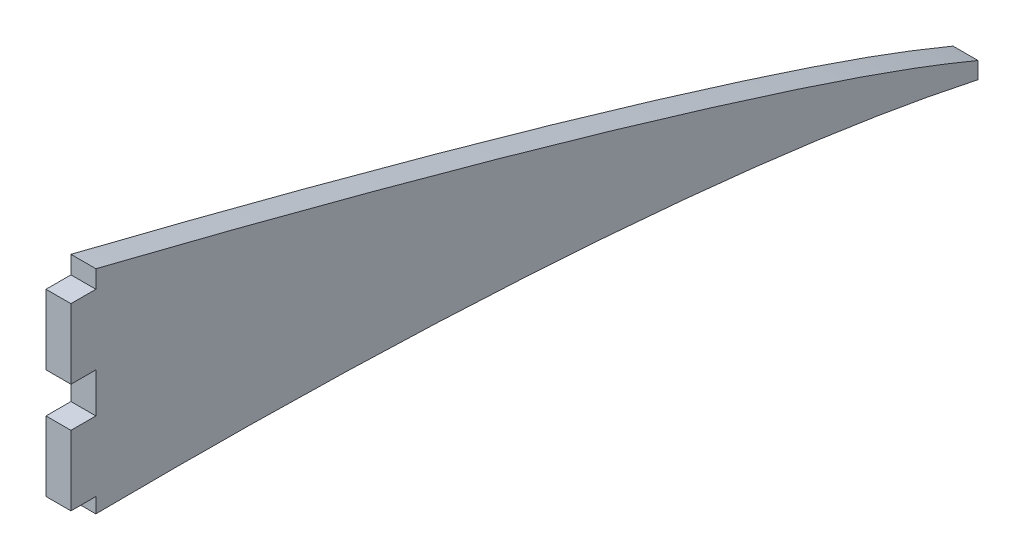
ISO-10303-21;
HEADER;
FILE_DESCRIPTION(('STEP AP214'),'2;1');
FILE_NAME('part.step','',(''),(''),'','','');
FILE_SCHEMA(('AUTOMOTIVE_DESIGN { 1 0 10303 214 1 1 1 1 }'));
ENDSEC;
DATA;
#1=APPLICATION_CONTEXT('core data for automotive mechanical design processes');
#2=APPLICATION_PROTOCOL_DEFINITION('international standard','automotive_design',2000,#1);
#3=PRODUCT_CONTEXT('',#1,'mechanical');
#4=PRODUCT('Part','Part','',(#3));
#5=PRODUCT_RELATED_PRODUCT_CATEGORY('part','',(#4));
#6=PRODUCT_DEFINITION_FORMATION('','',#4);
#7=PRODUCT_DEFINITION_CONTEXT('part definition',#1,'design');
#8=PRODUCT_DEFINITION('design','',#6,#7);
#9=PRODUCT_DEFINITION_SHAPE('','',#8);
#10=(LENGTH_UNIT() NAMED_UNIT(*) SI_UNIT(.MILLI.,.METRE.));
#11=(NAMED_UNIT(*) PLANE_ANGLE_UNIT() SI_UNIT($,.RADIAN.));
#12=(NAMED_UNIT(*) SI_UNIT($,.STERADIAN.) SOLID_ANGLE_UNIT());
#13=UNCERTAINTY_MEASURE_WITH_UNIT(LENGTH_MEASURE(1.E-05),#10,'distance_accuracy_value','');
#14=(GEOMETRIC_REPRESENTATION_CONTEXT(3) GLOBAL_UNCERTAINTY_ASSIGNED_CONTEXT((#13)) GLOBAL_UNIT_ASSIGNED_CONTEXT((#10,
#11,#12)) REPRESENTATION_CONTEXT('',''));
#15=CARTESIAN_POINT('',(0.,0.,0.));
#16=DIRECTION('',(0.,0.,1.));
#17=DIRECTION('',(1.,0.,0.));
#18=AXIS2_PLACEMENT_3D('',#15,#16,#17);
#19=CARTESIAN_POINT('',(318.9605,-5.23396627649312E-12,-652.571489798407));
#20=DIRECTION('',(0.,0.,1.));
#21=DIRECTION('',(0.,-1.,0.));
#22=AXIS2_PLACEMENT_3D('',#19,#20,#21);
#23=PLANE('',#22);
#24=DIRECTION('',(0.,-1.,0.));
#25=VECTOR('',#24,1.);
#26=CARTESIAN_POINT('',(318.9605,-5.23396627649312E-12,-652.571489798407));
#27=LINE('',#26,#25);
#28=CARTESIAN_POINT('',(318.9605,13.6496657683968,-652.571489798407));
#29=VERTEX_POINT('',#28);
#30=CARTESIAN_POINT('',(318.9605,8.56966576839677,-652.571489798407));
#31=VERTEX_POINT('',#30);
#32=EDGE_CURVE('E267',#29,#31,#27,.T.);
#33=ORIENTED_EDGE('',*,*,#32,.T.);
#34=DIRECTION('',(-1.,0.,0.));
#35=VECTOR('',#34,1.);
#36=CARTESIAN_POINT('',(322.1355,8.56966576839677,-652.571489798407));
#37=LINE('',#36,#35);
#38=CARTESIAN_POINT('',(322.1355,8.56966576839677,-652.571489798407));
#39=VERTEX_POINT('',#38);
#40=EDGE_CURVE('E351',#39,#31,#37,.T.);
#41=ORIENTED_EDGE('',*,*,#40,.F.);
#42=DIRECTION('',(0.,-1.,0.));
#43=VECTOR('',#42,1.);
#44=CARTESIAN_POINT('',(322.1355,-5.23396627649312E-12,-652.571489798407));
#45=LINE('',#44,#43);
#46=CARTESIAN_POINT('',(322.1355,13.6496657683968,-652.571489798407));
#47=VERTEX_POINT('',#46);
#48=EDGE_CURVE('E148',#47,#39,#45,.T.);
#49=ORIENTED_EDGE('',*,*,#48,.F.);
#50=DIRECTION('',(1.,0.,0.));
#51=VECTOR('',#50,1.);
#52=CARTESIAN_POINT('',(318.9605,13.6496657683968,-652.571489798407));
#53=LINE('',#52,#51);
#54=EDGE_CURVE('E149',#29,#47,#53,.T.);
#55=ORIENTED_EDGE('',*,*,#54,.F.);
#56=EDGE_LOOP('',(#33,#41,#49,#55));
#57=FACE_BOUND('',#56,.T.);
#58=ADVANCED_FACE('F35',(#57),#23,.T.);
#59=CARTESIAN_POINT('',(322.1355,-0.320334231603232,-652.571489798407));
#60=VERTEX_POINT('',#59);
#61=CARTESIAN_POINT('',(322.1355,-2.23985387101036,-652.571489798407));
#62=VERTEX_POINT('',#61);
#63=EDGE_CURVE('E266',#60,#62,#45,.T.);
#64=ORIENTED_EDGE('',*,*,#63,.F.);
#65=DIRECTION('',(1.,0.,0.));
#66=VECTOR('',#65,1.);
#67=CARTESIAN_POINT('',(318.9605,-0.320334231603232,-652.571489798407));
#68=LINE('',#67,#66);
#69=CARTESIAN_POINT('',(318.9605,-0.320334231603232,-652.571489798407));
#70=VERTEX_POINT('',#69);
#71=EDGE_CURVE('E142',#70,#60,#68,.T.);
#72=ORIENTED_EDGE('',*,*,#71,.F.);
#73=CARTESIAN_POINT('',(318.9605,-2.23985387101036,-652.571489798407));
#74=VERTEX_POINT('',#73);
#75=EDGE_CURVE('E39',#70,#74,#27,.T.);
#76=ORIENTED_EDGE('',*,*,#75,.T.);
#77=DIRECTION('',(1.,0.,0.));
#78=VECTOR('',#77,1.);
#79=CARTESIAN_POINT('',(318.9605,-2.23985387101036,-652.571489798407));
#80=LINE('',#79,#78);
#81=EDGE_CURVE('E281',#74,#62,#80,.T.);
#82=ORIENTED_EDGE('',*,*,#81,.T.);
#83=EDGE_LOOP('',(#64,#72,#76,#82));
#84=FACE_BOUND('',#83,.T.);
#85=ADVANCED_FACE('F333',(#84),#23,.T.);
#86=DIRECTION('',(-1.,0.,0.));
#87=VECTOR('',#86,1.);
#88=CARTESIAN_POINT('',(322.1355,22.5396657683968,-652.571489798407));
#89=LINE('',#88,#87);
#90=CARTESIAN_POINT('',(322.1355,22.5396657683968,-652.571489798407));
#91=VERTEX_POINT('',#90);
#92=CARTESIAN_POINT('',(318.9605,22.5396657683968,-652.571489798407));
#93=VERTEX_POINT('',#92);
#94=EDGE_CURVE('E60',#91,#93,#89,.T.);
#95=ORIENTED_EDGE('',*,*,#94,.F.);
#96=CARTESIAN_POINT('',(322.1355,24.8048879433305,-652.571489798407));
#97=VERTEX_POINT('',#96);
#98=EDGE_CURVE('E262',#97,#91,#45,.T.);
#99=ORIENTED_EDGE('',*,*,#98,.F.);
#100=DIRECTION('',(-1.,0.,0.));
#101=VECTOR('',#100,1.);
#102=CARTESIAN_POINT('',(322.1355,24.8048879433619,-652.571489798407));
#103=LINE('',#102,#101);
#104=CARTESIAN_POINT('',(318.9605,24.8048870003685,-652.571489563597));
#105=VERTEX_POINT('',#104);
#106=EDGE_CURVE('E215',#105,#97,#103,.F.);
#107=ORIENTED_EDGE('',*,*,#106,.F.);
#108=EDGE_CURVE('E303',#105,#93,#27,.T.);
#109=ORIENTED_EDGE('',*,*,#108,.T.);
#110=EDGE_LOOP('',(#95,#99,#107,#109));
#111=FACE_BOUND('',#110,.T.);
#112=ADVANCED_FACE('F316',(#111),#23,.T.);
#113=CARTESIAN_POINT('',(318.9605,-6.61910024298039E-11,-764.914772228696));
#114=DIRECTION('',(0.,0.,1.));
#115=DIRECTION('',(0.,-1.,0.));
#116=AXIS2_PLACEMENT_3D('',#113,#114,#115);
#117=PLANE('',#116);
#118=DIRECTION('',(0.,-1.,0.));
#119=VECTOR('',#118,1.);
#120=CARTESIAN_POINT('',(318.9605,-6.61910024298039E-11,-764.914772228696));
#121=LINE('',#120,#119);
#122=CARTESIAN_POINT('',(318.9605,-8.39822140576261,-764.914772230141));
#123=VERTEX_POINT('',#122);
#124=CARTESIAN_POINT('',(318.9605,-10.521558234471,-764.914772228695));
#125=VERTEX_POINT('',#124);
#126=EDGE_CURVE('E284',#123,#125,#121,.T.);
#127=ORIENTED_EDGE('',*,*,#126,.F.);
#128=DIRECTION('',(-1.,0.,0.));
#129=VECTOR('',#128,1.);
#130=CARTESIAN_POINT('',(322.1355,-8.39819946901701,-764.914772228696));
#131=LINE('',#130,#129);
#132=CARTESIAN_POINT('',(322.1355,-8.3982237642939,-764.914772230341));
#133=VERTEX_POINT('',#132);
#134=EDGE_CURVE('E217',#123,#133,#131,.F.);
#135=ORIENTED_EDGE('',*,*,#134,.T.);
#136=DIRECTION('',(0.,-1.,0.));
#137=VECTOR('',#136,1.);
#138=CARTESIAN_POINT('',(322.1355,-6.61910024298039E-11,-764.914772228696));
#139=LINE('',#138,#137);
#140=CARTESIAN_POINT('',(322.1355,-10.521558234471,-764.914772228695));
#141=VERTEX_POINT('',#140);
#142=EDGE_CURVE('E221',#133,#141,#139,.T.);
#143=ORIENTED_EDGE('',*,*,#142,.T.);
#144=DIRECTION('',(1.,0.,0.));
#145=VECTOR('',#144,1.);
#146=CARTESIAN_POINT('',(318.9605,-10.521558234471,-764.914772228695));
#147=LINE('',#146,#145);
#148=EDGE_CURVE('E45',#125,#141,#147,.T.);
#149=ORIENTED_EDGE('',*,*,#148,.F.);
#150=EDGE_LOOP('',(#127,#135,#143,#149));
#151=FACE_BOUND('',#150,.T.);
#152=ADVANCED_FACE('F37',(#151),#117,.F.);
#153=CARTESIAN_POINT('',(318.9605,-46.7109115468803,-217.6889282213));
#154=CARTESIAN_POINT('',(318.9605,-47.0811725017099,-223.563203895704));
#155=CARTESIAN_POINT('',(318.9605,-47.2500934142377,-229.434162866176));
#156=CARTESIAN_POINT('',(318.9605,-47.2929707774222,-241.171221814446));
#157=CARTESIAN_POINT('',(318.9605,-47.1703596848504,-247.037378335606));
#158=CARTESIAN_POINT('',(318.9605,-46.7241598751387,-258.766380644155));
#159=CARTESIAN_POINT('',(318.9605,-46.3968299079472,-264.629164801385));
#160=CARTESIAN_POINT('',(318.9605,-45.5838602946526,-276.352125257376));
#161=CARTESIAN_POINT('',(318.9605,-45.0974628641289,-282.214063736752));
#162=CARTESIAN_POINT('',(318.9605,-43.4504397936617,-299.78422343273));
#163=CARTESIAN_POINT('',(318.9605,-42.1079336405422,-311.467216876421));
#164=CARTESIAN_POINT('',(318.9605,-39.1246068009405,-334.79605475539));
#165=CARTESIAN_POINT('',(318.9605,-37.4825476592202,-346.441744966255));
#166=CARTESIAN_POINT('',(318.9605,-34.0387778258417,-369.71324403422));
#167=CARTESIAN_POINT('',(318.9605,-32.2359284261177,-381.336740766776));
#168=CARTESIAN_POINT('',(318.9605,-28.584627044405,-404.576274953222));
#169=CARTESIAN_POINT('',(318.9605,-26.7344775362052,-416.192224498263));
#170=CARTESIAN_POINT('',(318.9605,-23.0835963829604,-439.431824167152));
#171=CARTESIAN_POINT('',(318.9605,-21.2827871802833,-451.055363586507));
#172=CARTESIAN_POINT('',(318.9605,-17.8141511052346,-474.321607127042));
#173=CARTESIAN_POINT('',(318.9605,-16.1455183469495,-485.964264476007));
#174=CARTESIAN_POINT('',(318.9605,-13.0116707458024,-509.279109497379));
#175=CARTESIAN_POINT('',(318.9605,-11.5456140247182,-520.950876080307));
#176=CARTESIAN_POINT('',(318.9605,-8.87995206854031,-544.319668682905));
#177=CARTESIAN_POINT('',(318.9605,-7.67961166386372,-556.017979264413));
#178=CARTESIAN_POINT('',(318.9605,-4.55557730966387,-591.163004601657));
#179=CARTESIAN_POINT('',(318.9605,-3.10703626166825,-614.661003199625));
#180=CARTESIAN_POINT('',(318.9605,-2.19947564817055,-649.935966575727));
#181=CARTESIAN_POINT('',(318.9605,-2.10855312791373,-661.702560907976));
#182=CARTESIAN_POINT('',(318.9605,-2.3438243546616,-679.343468905308));
#183=CARTESIAN_POINT('',(318.9605,-2.48506397622628,-685.222739923224));
#184=CARTESIAN_POINT('',(318.9605,-2.90927192286684,-696.978954297392));
#185=CARTESIAN_POINT('',(318.9605,-3.19157831574303,-702.854564160096));
#186=CARTESIAN_POINT('',(318.9605,-3.9191913833493,-714.592323323093));
#187=CARTESIAN_POINT('',(318.9605,-4.36429563641981,-720.45550541118));
#188=CARTESIAN_POINT('',(318.9605,-5.18145391295636,-729.239801175919));
#189=CARTESIAN_POINT('',(318.9605,-5.47952085475348,-732.167256327345));
#190=CARTESIAN_POINT('',(318.9605,-6.13578034902531,-738.010202725779));
#191=CARTESIAN_POINT('',(318.9605,-6.49404129916263,-740.925935314802));
#192=CARTESIAN_POINT('',(318.9605,-7.67721283705708,-749.652482820934));
#193=CARTESIAN_POINT('',(318.9605,-8.60597690699942,-755.443511526436));
#194=CARTESIAN_POINT('',(318.9605,-10.3212397926949,-764.068684752377));
#195=CARTESIAN_POINT('',(318.9605,-10.9474294479088,-766.933371445368));
#196=CARTESIAN_POINT('',(318.9605,-12.3185131269665,-772.640129222253));
#197=CARTESIAN_POINT('',(318.9605,-13.0607392117884,-775.482708603076));
#198=CARTESIAN_POINT('',(318.9605,-13.878275220424,-778.310939903727));
#199=B_SPLINE_CURVE_WITH_KNOTS('',3,(#153,#154,#155,#156,#157,#158,#159,#160,#161,#162,#163,
#164,#165,#166,#167,#168,#169,#170,#171,#172,#173,#174,#175,#176,#177,#178,#179,#180,#181,#182,
#183,#184,#185,#186,#187,#188,#189,#190,#191,#192,#193,#194,#195,#196,#197,#198),.UNSPECIFIED.,
.F.,.F.,(4,2,2,2,2,2,2,2,2,2,2,2,2,2,2,2,2,2,2,2,2,2,4),(0.,0.0312500000000002,
0.0625000000000004,0.0937500000000005,0.125000000000001,0.187500000000001,0.250000000000001,
0.312500000000001,0.375000000000001,0.437500000000001,0.500000000000001,0.562500000000002,
0.625000000000002,0.750000000000002,0.812500000000002,0.843750000000002,0.875000000000002,
0.906250000000001,0.921875000000001,0.937500000000001,0.968750000000001,0.984375,1.),.UNSPECIFIED.);
#200=DIRECTION('',(1.,0.,0.));
#201=VECTOR('',#200,1.);
#202=SURFACE_OF_LINEAR_EXTRUSION('',#199,#201);
#203=CARTESIAN_POINT('',(322.1355,-10.521558234471,-764.914772228695));
#204=CARTESIAN_POINT('',(322.1355,-10.2537720290722,-763.676377355801));
#205=CARTESIAN_POINT('',(322.1355,-9.99654668576632,-762.435970422764));
#206=CARTESIAN_POINT('',(322.1355,-8.60597690699942,-755.443511526436));
#207=CARTESIAN_POINT('',(322.1355,-7.67721283705708,-749.652482820934));
#208=CARTESIAN_POINT('',(322.1355,-6.49404129916263,-740.925935314802));
#209=CARTESIAN_POINT('',(322.1355,-6.13578034902531,-738.010202725779));
#210=CARTESIAN_POINT('',(322.1355,-5.47952085475348,-732.167256327345));
#211=CARTESIAN_POINT('',(322.1355,-5.18145391295636,-729.239801175919));
#212=CARTESIAN_POINT('',(322.1355,-4.36429563641981,-720.45550541118));
#213=CARTESIAN_POINT('',(322.1355,-3.9191913833493,-714.592323323093));
#214=CARTESIAN_POINT('',(322.1355,-3.19157831574303,-702.854564160096));
#215=CARTESIAN_POINT('',(322.1355,-2.90927192286684,-696.978954297392));
#216=CARTESIAN_POINT('',(322.1355,-2.48506397622628,-685.222739923224));
#217=CARTESIAN_POINT('',(322.1355,-2.3438243546616,-679.343468905308));
#218=CARTESIAN_POINT('',(322.1355,-2.17254021828997,-666.500386761767));
#219=CARTESIAN_POINT('',(322.1355,-2.16652679167241,-659.535508052706));
#220=CARTESIAN_POINT('',(322.1355,-2.23985387101037,-652.571489798407));
#221=B_SPLINE_CURVE_WITH_KNOTS('',3,(#203,#204,#205,#206,#207,#208,#209,#210,#211,#212,#213,
#214,#215,#216,#217,#218,#219,#220),.UNSPECIFIED.,.F.,.F.,(4,2,2,2,2,2,2,2,4),
(0.775497336863897,0.78224906763257,0.81349906763257,0.82912406763257,0.84474906763257,
0.87599906763257,0.907249067632569,0.938499067632569,0.975501730768674),.UNSPECIFIED.);
#222=EDGE_CURVE('E278',#62,#141,#221,.F.);
#223=ORIENTED_EDGE('',*,*,#222,.F.);
#224=ORIENTED_EDGE('',*,*,#81,.F.);
#225=CARTESIAN_POINT('',(318.9605,-2.23985387101037,-652.571489798407));
#226=CARTESIAN_POINT('',(318.9605,-2.16652679167241,-659.535508052706));
#227=CARTESIAN_POINT('',(318.9605,-2.17254021828997,-666.500386761767));
#228=CARTESIAN_POINT('',(318.9605,-2.3438243546616,-679.343468905308));
#229=CARTESIAN_POINT('',(318.9605,-2.48506397622628,-685.222739923224));
#230=CARTESIAN_POINT('',(318.9605,-2.90927192286684,-696.978954297392));
#231=CARTESIAN_POINT('',(318.9605,-3.19157831574303,-702.854564160096));
#232=CARTESIAN_POINT('',(318.9605,-3.9191913833493,-714.592323323093));
#233=CARTESIAN_POINT('',(318.9605,-4.36429563641981,-720.45550541118));
#234=CARTESIAN_POINT('',(318.9605,-5.18145391295636,-729.239801175919));
#235=CARTESIAN_POINT('',(318.9605,-5.47952085475348,-732.167256327345));
#236=CARTESIAN_POINT('',(318.9605,-6.13578034902531,-738.010202725779));
#237=CARTESIAN_POINT('',(318.9605,-6.49404129916263,-740.925935314802));
#238=CARTESIAN_POINT('',(318.9605,-7.67721283705708,-749.652482820934));
#239=CARTESIAN_POINT('',(318.9605,-8.60597690699942,-755.443511526436));
#240=CARTESIAN_POINT('',(318.9605,-9.99654668576632,-762.435970422764));
#241=CARTESIAN_POINT('',(318.9605,-10.2537720290722,-763.676377355801));
#242=CARTESIAN_POINT('',(318.9605,-10.521558234471,-764.914772228695));
#243=B_SPLINE_CURVE_WITH_KNOTS('',3,(#225,#226,#227,#228,#229,#230,#231,#232,#233,#234,#235,
#236,#237,#238,#239,#240,#241,#242),.UNSPECIFIED.,.F.,.F.,(4,2,2,2,2,2,2,2,4),
(0.775497336863897,0.812500000000002,0.843750000000002,0.875000000000002,0.906250000000001,
0.921875000000001,0.937500000000001,0.968750000000001,0.975501730768674),.UNSPECIFIED.);
#244=EDGE_CURVE('E280',#74,#125,#243,.T.);
#245=ORIENTED_EDGE('',*,*,#244,.T.);
#246=ORIENTED_EDGE('',*,*,#148,.T.);
#247=EDGE_LOOP('',(#223,#224,#245,#246));
#248=FACE_BOUND('',#247,.T.);
#249=ADVANCED_FACE('F234',(#248),#202,.T.);
#250=CARTESIAN_POINT('',(318.9605,0.,0.));
#251=DIRECTION('',(1.,0.,0.));
#252=DIRECTION('',(0.,0.,-1.));
#253=AXIS2_PLACEMENT_3D('',#250,#251,#252);
#254=PLANE('',#253);
#255=ORIENTED_EDGE('',*,*,#108,.F.);
#256=CARTESIAN_POINT('',(318.9605,-8.39820275248085,-764.914780055489));
#257=CARTESIAN_POINT('',(318.9605,-7.4955475297725,-762.763120753182));
#258=CARTESIAN_POINT('',(318.9605,-6.63589922717803,-760.593830791067));
#259=CARTESIAN_POINT('',(318.9605,-4.85026048436324,-755.890796197998));
#260=CARTESIAN_POINT('',(318.9605,-3.93676254301451,-753.351930275002));
#261=CARTESIAN_POINT('',(318.9605,-2.16669271476364,-748.25086162885));
#262=CARTESIAN_POINT('',(318.9605,-1.30987470038387,-745.6887598055));
#263=CARTESIAN_POINT('',(318.9605,0.36660769882292,-740.549325051769));
#264=CARTESIAN_POINT('',(318.9605,1.18696155278745,-737.97319911904));
#265=CARTESIAN_POINT('',(318.9605,2.80310720693577,-732.814554877597));
#266=CARTESIAN_POINT('',(318.9605,3.59801814860503,-730.231305632151));
#267=CARTESIAN_POINT('',(318.9605,5.94893158393792,-722.471467171176));
#268=CARTESIAN_POINT('',(318.9605,7.47175072768402,-717.284977006816));
#269=CARTESIAN_POINT('',(318.9605,10.4497297148717,-706.891809105961));
#270=CARTESIAN_POINT('',(318.9605,11.9054506554351,-701.684945223968));
#271=CARTESIAN_POINT('',(318.9605,14.7655778197895,-691.258573312585));
#272=CARTESIAN_POINT('',(318.9605,16.1704157038341,-686.038941126429));
#273=CARTESIAN_POINT('',(318.9605,20.0395641404876,-671.417279010473));
#274=CARTESIAN_POINT('',(318.9605,22.4551262568884,-662.002791797907));
#275=CARTESIAN_POINT('',(318.9605,24.804887943331,-652.571489798531));
#276=B_SPLINE_CURVE_WITH_KNOTS('',3,(#256,#257,#258,#259,#260,#261,#262,#263,#264,#265,#266,
#267,#268,#269,#270,#271,#272,#273,#274,#275),.UNSPECIFIED.,.F.,.F.,(4,2,2,2,2,2,2,2,2,4),
(0.0709020773267413,0.124999999999998,0.187499999999998,0.249999999999998,0.312499999999998,
0.374999999999998,0.499999999999998,0.624999999999998,0.749999999999998,0.974781211426537),.UNSPECIFIED.);
#277=EDGE_CURVE('E178',#123,#105,#276,.T.);
#278=ORIENTED_EDGE('',*,*,#277,.F.);
#279=ORIENTED_EDGE('',*,*,#126,.T.);
#280=ORIENTED_EDGE('',*,*,#244,.F.);
#281=ORIENTED_EDGE('',*,*,#75,.F.);
#282=DIRECTION('',(0.,0.,-1.));
#283=VECTOR('',#282,1.);
#284=CARTESIAN_POINT('',(318.9605,-0.320334231603232,-649.396489798407));
#285=LINE('',#284,#283);
#286=CARTESIAN_POINT('',(318.9605,-0.320334231603232,-649.396489798407));
#287=VERTEX_POINT('',#286);
#288=EDGE_CURVE('E153',#287,#70,#285,.T.);
#289=ORIENTED_EDGE('',*,*,#288,.F.);
#290=DIRECTION('',(0.,-1.,0.));
#291=VECTOR('',#290,1.);
#292=CARTESIAN_POINT('',(318.9605,8.56966576839677,-649.396489798407));
#293=LINE('',#292,#291);
#294=CARTESIAN_POINT('',(318.9605,8.56966576839677,-649.396489798407));
#295=VERTEX_POINT('',#294);
#296=EDGE_CURVE('E136',#295,#287,#293,.T.);
#297=ORIENTED_EDGE('',*,*,#296,.F.);
#298=DIRECTION('',(0.,0.,-1.));
#299=VECTOR('',#298,1.);
#300=CARTESIAN_POINT('',(318.9605,8.56966576839677,-649.396489798407));
#301=LINE('',#300,#299);
#302=EDGE_CURVE('E133',#295,#31,#301,.T.);
#303=ORIENTED_EDGE('',*,*,#302,.T.);
#304=ORIENTED_EDGE('',*,*,#32,.F.);
#305=DIRECTION('',(0.,0.,-1.));
#306=VECTOR('',#305,1.);
#307=CARTESIAN_POINT('',(318.9605,13.6496657683968,-649.396489798407));
#308=LINE('',#307,#306);
#309=CARTESIAN_POINT('',(318.9605,13.6496657683968,-649.396489798407));
#310=VERTEX_POINT('',#309);
#311=EDGE_CURVE('E175',#310,#29,#308,.T.);
#312=ORIENTED_EDGE('',*,*,#311,.F.);
#313=DIRECTION('',(0.,-1.,0.));
#314=VECTOR('',#313,1.);
#315=CARTESIAN_POINT('',(318.9605,22.5396657683968,-649.396489798407));
#316=LINE('',#315,#314);
#317=CARTESIAN_POINT('',(318.9605,22.5396657683968,-649.396489798407));
#318=VERTEX_POINT('',#317);
#319=EDGE_CURVE('E157',#318,#310,#316,.T.);
#320=ORIENTED_EDGE('',*,*,#319,.F.);
#321=DIRECTION('',(0.,0.,-1.));
#322=VECTOR('',#321,1.);
#323=CARTESIAN_POINT('',(318.9605,22.5396657683968,-649.396489798407));
#324=LINE('',#323,#322);
#325=EDGE_CURVE('E165',#318,#93,#324,.T.);
#326=ORIENTED_EDGE('',*,*,#325,.T.);
#327=EDGE_LOOP('',(#255,#278,#279,#280,#281,#289,#297,#303,#304,#312,#320,#326));
#328=FACE_BOUND('',#327,.T.);
#329=ADVANCED_FACE('F198',(#328),#254,.F.);
#330=CARTESIAN_POINT('',(322.1355,0.,0.));
#331=DIRECTION('',(1.,0.,0.));
#332=DIRECTION('',(0.,0.,-1.));
#333=AXIS2_PLACEMENT_3D('',#330,#331,#332);
#334=PLANE('',#333);
#335=CARTESIAN_POINT('',(322.1355,24.8048879433308,-652.571489798532));
#336=CARTESIAN_POINT('',(322.1355,22.4551262568883,-662.002791797907));
#337=CARTESIAN_POINT('',(322.1355,20.0395641404875,-671.417279010473));
#338=CARTESIAN_POINT('',(322.1355,16.1704157038341,-686.038941126429));
#339=CARTESIAN_POINT('',(322.1355,14.7655778197895,-691.258573312585));
#340=CARTESIAN_POINT('',(322.1355,11.9054506554351,-701.684945223968));
#341=CARTESIAN_POINT('',(322.1355,10.4497297148717,-706.891809105961));
#342=CARTESIAN_POINT('',(322.1355,7.47175072768402,-717.284977006816));
#343=CARTESIAN_POINT('',(322.1355,5.94893158393792,-722.471467171176));
#344=CARTESIAN_POINT('',(322.1355,3.59801814860503,-730.231305632151));
#345=CARTESIAN_POINT('',(322.1355,2.80310720693577,-732.814554877597));
#346=CARTESIAN_POINT('',(322.1355,1.18696155278745,-737.97319911904));
#347=CARTESIAN_POINT('',(322.1355,0.36660769882292,-740.549325051769));
#348=CARTESIAN_POINT('',(322.1355,-1.30987470038387,-745.6887598055));
#349=CARTESIAN_POINT('',(322.1355,-2.16669271476364,-748.25086162885));
#350=CARTESIAN_POINT('',(322.1355,-3.93676254301451,-753.351930275002));
#351=CARTESIAN_POINT('',(322.1355,-4.85026048436324,-755.890796197998));
#352=CARTESIAN_POINT('',(322.1355,-6.63589933501185,-760.593831075081));
#353=CARTESIAN_POINT('',(322.1355,-7.49554775355311,-762.763121317884));
#354=CARTESIAN_POINT('',(322.1355,-8.39820310494488,-764.914780895657));
#355=B_SPLINE_CURVE_WITH_KNOTS('',3,(#335,#336,#337,#338,#339,#340,#341,#342,#343,#344,#345,
#346,#347,#348,#349,#350,#351,#352,#353,#354),.UNSPECIFIED.,.F.,.F.,(4,2,2,2,2,2,2,2,2,4),
(0.0709020702854513,0.295683281711986,0.420683281711986,0.545683281711986,0.670683281711986,
0.733183281711986,0.795683281711986,0.858183281711986,0.920683281711986,0.974781211426532),.UNSPECIFIED.);
#356=EDGE_CURVE('E11',#97,#133,#355,.T.);
#357=ORIENTED_EDGE('',*,*,#356,.F.);
#358=ORIENTED_EDGE('',*,*,#98,.T.);
#359=DIRECTION('',(0.,0.,-1.));
#360=VECTOR('',#359,1.);
#361=CARTESIAN_POINT('',(322.1355,22.5396657683968,-649.396489798407));
#362=LINE('',#361,#360);
#363=CARTESIAN_POINT('',(322.1355,22.5396657683968,-649.396489798407));
#364=VERTEX_POINT('',#363);
#365=EDGE_CURVE('E170',#364,#91,#362,.T.);
#366=ORIENTED_EDGE('',*,*,#365,.F.);
#367=DIRECTION('',(0.,1.,0.));
#368=VECTOR('',#367,1.);
#369=CARTESIAN_POINT('',(322.1355,13.6496657683968,-649.396489798407));
#370=LINE('',#369,#368);
#371=CARTESIAN_POINT('',(322.1355,13.6496657683968,-649.396489798407));
#372=VERTEX_POINT('',#371);
#373=EDGE_CURVE('E162',#372,#364,#370,.T.);
#374=ORIENTED_EDGE('',*,*,#373,.F.);
#375=DIRECTION('',(0.,0.,-1.));
#376=VECTOR('',#375,1.);
#377=CARTESIAN_POINT('',(322.1355,13.6496657683968,-649.396489798407));
#378=LINE('',#377,#376);
#379=EDGE_CURVE('E173',#372,#47,#378,.T.);
#380=ORIENTED_EDGE('',*,*,#379,.T.);
#381=ORIENTED_EDGE('',*,*,#48,.T.);
#382=DIRECTION('',(0.,0.,-1.));
#383=VECTOR('',#382,1.);
#384=CARTESIAN_POINT('',(322.1355,8.56966576839677,-649.396489798407));
#385=LINE('',#384,#383);
#386=CARTESIAN_POINT('',(322.1355,8.56966576839677,-649.396489798407));
#387=VERTEX_POINT('',#386);
#388=EDGE_CURVE('E130',#387,#39,#385,.T.);
#389=ORIENTED_EDGE('',*,*,#388,.F.);
#390=DIRECTION('',(0.,1.,0.));
#391=VECTOR('',#390,1.);
#392=CARTESIAN_POINT('',(322.1355,-0.320334231603232,-649.396489798407));
#393=LINE('',#392,#391);
#394=CARTESIAN_POINT('',(322.1355,-0.320334231603232,-649.396489798407));
#395=VERTEX_POINT('',#394);
#396=EDGE_CURVE('E137',#395,#387,#393,.T.);
#397=ORIENTED_EDGE('',*,*,#396,.F.);
#398=DIRECTION('',(0.,0.,-1.));
#399=VECTOR('',#398,1.);
#400=CARTESIAN_POINT('',(322.1355,-0.320334231603232,-649.396489798407));
#401=LINE('',#400,#399);
#402=EDGE_CURVE('E52',#395,#60,#401,.T.);
#403=ORIENTED_EDGE('',*,*,#402,.T.);
#404=ORIENTED_EDGE('',*,*,#63,.T.);
#405=ORIENTED_EDGE('',*,*,#222,.T.);
#406=ORIENTED_EDGE('',*,*,#142,.F.);
#407=EDGE_LOOP('',(#357,#358,#366,#374,#380,#381,#389,#397,#403,#404,#405,#406));
#408=FACE_BOUND('',#407,.T.);
#409=ADVANCED_FACE('F146',(#408),#334,.T.);
#410=CARTESIAN_POINT('',(322.1355,-12.1987585063665,-773.271760863247));
#411=CARTESIAN_POINT('',(322.1355,-11.6011401350157,-772.060077223812));
#412=CARTESIAN_POINT('',(322.1355,-11.0205369965513,-770.841418200375));
#413=CARTESIAN_POINT('',(322.1355,-9.89571889514431,-768.389182843868));
#414=CARTESIAN_POINT('',(322.1355,-9.35124624168938,-767.155712150863));
#415=CARTESIAN_POINT('',(322.1355,-7.76332736173608,-763.436647752493));
#416=CARTESIAN_POINT('',(322.1355,-6.7645728300243,-760.932732715006));
#417=CARTESIAN_POINT('',(322.1355,-4.85026048436324,-755.890796197998));
#418=CARTESIAN_POINT('',(322.1355,-3.93676254301451,-753.351930275002));
#419=CARTESIAN_POINT('',(322.1355,-2.16669271476364,-748.25086162885));
#420=CARTESIAN_POINT('',(322.1355,-1.30987470038387,-745.6887598055));
#421=CARTESIAN_POINT('',(322.1355,0.36660769882292,-740.549325051769));
#422=CARTESIAN_POINT('',(322.1355,1.18696155278745,-737.97319911904));
#423=CARTESIAN_POINT('',(322.1355,2.80310720693577,-732.814554877597));
#424=CARTESIAN_POINT('',(322.1355,3.59801814860503,-730.231305632151));
#425=CARTESIAN_POINT('',(322.1355,5.94893158393792,-722.471467171176));
#426=CARTESIAN_POINT('',(322.1355,7.47175072768402,-717.284977006816));
#427=CARTESIAN_POINT('',(322.1355,10.4497297148717,-706.891809105961));
#428=CARTESIAN_POINT('',(322.1355,11.9054506554351,-701.684945223968));
#429=CARTESIAN_POINT('',(322.1355,14.7655778197895,-691.258573312585));
#430=CARTESIAN_POINT('',(322.1355,16.1704157038341,-686.038941126429));
#431=CARTESIAN_POINT('',(322.1355,20.3185249113802,-670.363075429923));
#432=CARTESIAN_POINT('',(322.1355,22.9962504259785,-659.890092199189));
#433=CARTESIAN_POINT('',(322.1355,25.5932880157197,-649.396489798407));
#434=B_SPLINE_CURVE_WITH_KNOTS('',3,(#410,#411,#412,#413,#414,#415,#416,#417,#418,#419,#420,
#421,#422,#423,#424,#425,#426,#427,#428,#429,#430,#431,#432,#433),.UNSPECIFIED.,.F.,.F.,(4,2,2,
2,2,2,2,2,2,2,2,4),(0.,0.0312499999999989,0.0624999999999978,0.124999999999998,
0.187499999999998,0.249999999999998,0.312499999999998,0.374999999999998,0.499999999999998,
0.624999999999998,0.749999999999998,1.),.UNSPECIFIED.);
#435=DIRECTION('',(-1.,0.,0.));
#436=VECTOR('',#435,1.);
#437=SURFACE_OF_LINEAR_EXTRUSION('',#434,#436);
#438=ORIENTED_EDGE('',*,*,#277,.T.);
#439=ORIENTED_EDGE('',*,*,#106,.T.);
#440=ORIENTED_EDGE('',*,*,#356,.T.);
#441=ORIENTED_EDGE('',*,*,#134,.F.);
#442=EDGE_LOOP('',(#438,#439,#440,#441));
#443=FACE_BOUND('',#442,.T.);
#444=ADVANCED_FACE('F190',(#443),#437,.F.);
#445=CARTESIAN_POINT('',(318.9605,13.6496657683968,-649.396489798407));
#446=DIRECTION('',(0.,1.,0.));
#447=DIRECTION('',(0.,0.,1.));
#448=AXIS2_PLACEMENT_3D('',#445,#446,#447);
#449=PLANE('',#448);
#450=ORIENTED_EDGE('',*,*,#54,.T.);
#451=ORIENTED_EDGE('',*,*,#379,.F.);
#452=DIRECTION('',(1.,0.,0.));
#453=VECTOR('',#452,1.);
#454=CARTESIAN_POINT('',(318.9605,13.6496657683968,-649.396489798407));
#455=LINE('',#454,#453);
#456=EDGE_CURVE('E160',#310,#372,#455,.T.);
#457=ORIENTED_EDGE('',*,*,#456,.F.);
#458=ORIENTED_EDGE('',*,*,#311,.T.);
#459=EDGE_LOOP('',(#450,#451,#457,#458));
#460=FACE_BOUND('',#459,.T.);
#461=ADVANCED_FACE('F195',(#460),#449,.F.);
#462=CARTESIAN_POINT('',(322.1355,22.5396657683968,-649.396489798407));
#463=DIRECTION('',(0.,-1.,0.));
#464=DIRECTION('',(1.,0.,0.));
#465=AXIS2_PLACEMENT_3D('',#462,#463,#464);
#466=PLANE('',#465);
#467=ORIENTED_EDGE('',*,*,#94,.T.);
#468=ORIENTED_EDGE('',*,*,#325,.F.);
#469=DIRECTION('',(-1.,0.,0.));
#470=VECTOR('',#469,1.);
#471=CARTESIAN_POINT('',(322.1355,22.5396657683968,-649.396489798407));
#472=LINE('',#471,#470);
#473=EDGE_CURVE('E164',#364,#318,#472,.T.);
#474=ORIENTED_EDGE('',*,*,#473,.F.);
#475=ORIENTED_EDGE('',*,*,#365,.T.);
#476=EDGE_LOOP('',(#467,#468,#474,#475));
#477=FACE_BOUND('',#476,.T.);
#478=ADVANCED_FACE('F318',(#477),#466,.F.);
#479=CARTESIAN_POINT('',(0.,0.,-649.396489798407));
#480=DIRECTION('',(0.,0.,1.));
#481=DIRECTION('',(1.,0.,0.));
#482=AXIS2_PLACEMENT_3D('',#479,#480,#481);
#483=PLANE('',#482);
#484=ORIENTED_EDGE('',*,*,#319,.T.);
#485=ORIENTED_EDGE('',*,*,#456,.T.);
#486=ORIENTED_EDGE('',*,*,#373,.T.);
#487=ORIENTED_EDGE('',*,*,#473,.T.);
#488=EDGE_LOOP('',(#484,#485,#486,#487));
#489=FACE_BOUND('',#488,.T.);
#490=ADVANCED_FACE('F324',(#489),#483,.T.);
#491=CARTESIAN_POINT('',(322.1355,8.56966576839677,-649.396489798407));
#492=DIRECTION('',(0.,-1.,0.));
#493=DIRECTION('',(0.,0.,-1.));
#494=AXIS2_PLACEMENT_3D('',#491,#492,#493);
#495=PLANE('',#494);
#496=ORIENTED_EDGE('',*,*,#40,.T.);
#497=ORIENTED_EDGE('',*,*,#302,.F.);
#498=DIRECTION('',(-1.,0.,0.));
#499=VECTOR('',#498,1.);
#500=CARTESIAN_POINT('',(322.1355,8.56966576839677,-649.396489798407));
#501=LINE('',#500,#499);
#502=EDGE_CURVE('E126',#387,#295,#501,.T.);
#503=ORIENTED_EDGE('',*,*,#502,.F.);
#504=ORIENTED_EDGE('',*,*,#388,.T.);
#505=EDGE_LOOP('',(#496,#497,#503,#504));
#506=FACE_BOUND('',#505,.T.);
#507=ADVANCED_FACE('F128',(#506),#495,.F.);
#508=CARTESIAN_POINT('',(318.9605,-0.320334231603232,-649.396489798407));
#509=DIRECTION('',(0.,1.,0.));
#510=DIRECTION('',(0.,0.,1.));
#511=AXIS2_PLACEMENT_3D('',#508,#509,#510);
#512=PLANE('',#511);
#513=ORIENTED_EDGE('',*,*,#71,.T.);
#514=ORIENTED_EDGE('',*,*,#402,.F.);
#515=DIRECTION('',(1.,0.,0.));
#516=VECTOR('',#515,1.);
#517=CARTESIAN_POINT('',(318.9605,-0.320334231603232,-649.396489798407));
#518=LINE('',#517,#516);
#519=EDGE_CURVE('E141',#287,#395,#518,.T.);
#520=ORIENTED_EDGE('',*,*,#519,.F.);
#521=ORIENTED_EDGE('',*,*,#288,.T.);
#522=EDGE_LOOP('',(#513,#514,#520,#521));
#523=FACE_BOUND('',#522,.T.);
#524=ADVANCED_FACE('F346',(#523),#512,.F.);
#525=CARTESIAN_POINT('',(0.,0.,-649.396489798407));
#526=DIRECTION('',(0.,0.,1.));
#527=DIRECTION('',(1.,0.,0.));
#528=AXIS2_PLACEMENT_3D('',#525,#526,#527);
#529=PLANE('',#528);
#530=ORIENTED_EDGE('',*,*,#396,.T.);
#531=ORIENTED_EDGE('',*,*,#502,.T.);
#532=ORIENTED_EDGE('',*,*,#296,.T.);
#533=ORIENTED_EDGE('',*,*,#519,.T.);
#534=EDGE_LOOP('',(#530,#531,#532,#533));
#535=FACE_BOUND('',#534,.T.);
#536=ADVANCED_FACE('F139',(#535),#529,.T.);
#537=CLOSED_SHELL('',(#58,#85,#112,#152,#249,#329,#409,#444,#461,#478,#490,#507,#524,#536));
#538=MANIFOLD_SOLID_BREP('B2',#537);
#539=ADVANCED_BREP_SHAPE_REPRESENTATION('',(#18,#538),#14);
#540=SHAPE_DEFINITION_REPRESENTATION(#9,#539);
ENDSEC;
END-ISO-10303-21;
